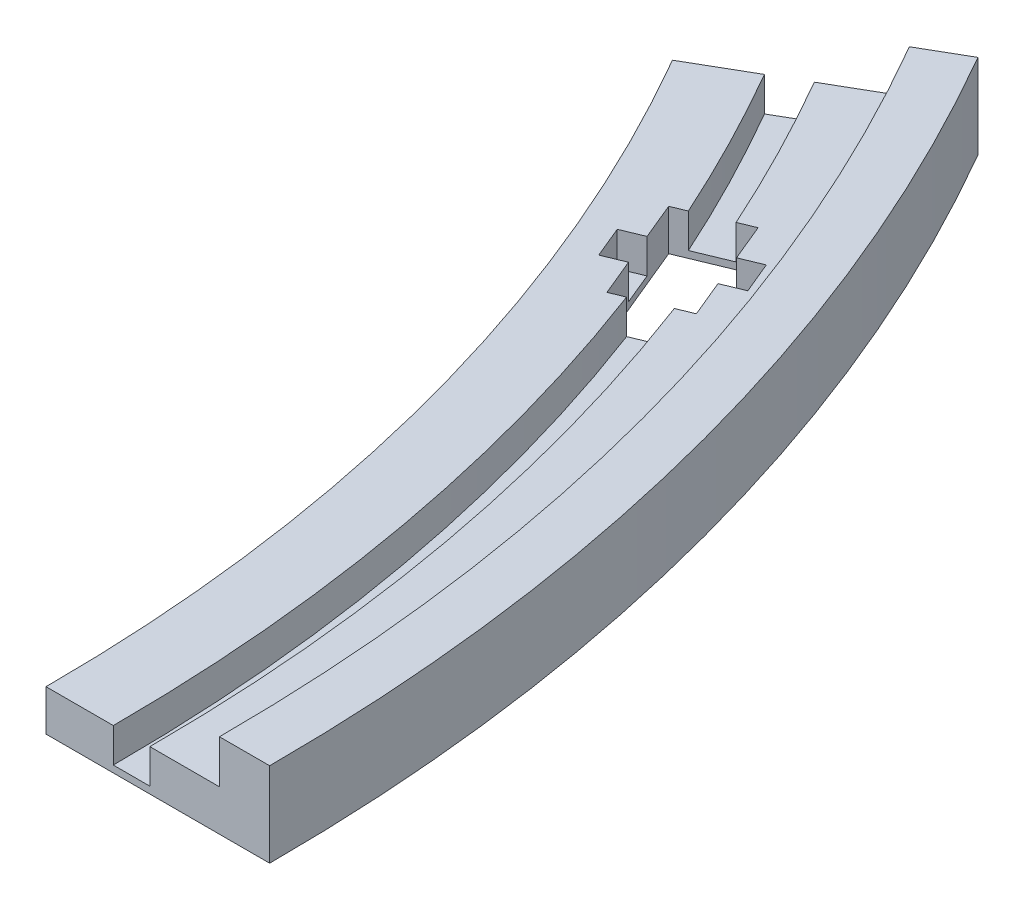
ISO-10303-21;
HEADER;
FILE_DESCRIPTION(('STEP AP214'),'2;1');
FILE_NAME('part.step','',(''),(''),'','','');
FILE_SCHEMA(('AUTOMOTIVE_DESIGN { 1 0 10303 214 1 1 1 1 }'));
ENDSEC;
DATA;
#1=APPLICATION_CONTEXT('core data for automotive mechanical design processes');
#2=APPLICATION_PROTOCOL_DEFINITION('international standard','automotive_design',2000,#1);
#3=PRODUCT_CONTEXT('',#1,'mechanical');
#4=PRODUCT('Part','Part','',(#3));
#5=PRODUCT_RELATED_PRODUCT_CATEGORY('part','',(#4));
#6=PRODUCT_DEFINITION_FORMATION('','',#4);
#7=PRODUCT_DEFINITION_CONTEXT('part definition',#1,'design');
#8=PRODUCT_DEFINITION('design','',#6,#7);
#9=PRODUCT_DEFINITION_SHAPE('','',#8);
#10=(LENGTH_UNIT() NAMED_UNIT(*) SI_UNIT(.MILLI.,.METRE.));
#11=(NAMED_UNIT(*) PLANE_ANGLE_UNIT() SI_UNIT($,.RADIAN.));
#12=(NAMED_UNIT(*) SI_UNIT($,.STERADIAN.) SOLID_ANGLE_UNIT());
#13=UNCERTAINTY_MEASURE_WITH_UNIT(LENGTH_MEASURE(1.E-05),#10,'distance_accuracy_value','');
#14=(GEOMETRIC_REPRESENTATION_CONTEXT(3) GLOBAL_UNCERTAINTY_ASSIGNED_CONTEXT((#13)) GLOBAL_UNIT_ASSIGNED_CONTEXT((#10,
#11,#12)) REPRESENTATION_CONTEXT('',''));
#15=CARTESIAN_POINT('',(0.,0.,0.));
#16=DIRECTION('',(0.,0.,1.));
#17=DIRECTION('',(1.,0.,0.));
#18=AXIS2_PLACEMENT_3D('',#15,#16,#17);
#19=CARTESIAN_POINT('',(0.,3.6,0.));
#20=DIRECTION('',(0.,1.,0.));
#21=DIRECTION('',(0.,0.,1.));
#22=AXIS2_PLACEMENT_3D('',#19,#20,#21);
#23=PLANE('',#22);
#24=DIRECTION('',(1.,0.,0.));
#25=VECTOR('',#24,1.);
#26=CARTESIAN_POINT('',(150.,3.6,0.));
#27=LINE('',#26,#25);
#28=CARTESIAN_POINT('',(159.1,3.6,0.));
#29=VERTEX_POINT('',#28);
#30=CARTESIAN_POINT('',(165.2,3.6,0.));
#31=VERTEX_POINT('',#30);
#32=EDGE_CURVE('E57',#29,#31,#27,.T.);
#33=ORIENTED_EDGE('',*,*,#32,.T.);
#34=CARTESIAN_POINT('',(0.,3.6,0.));
#35=DIRECTION('',(0.,-1.,0.));
#36=DIRECTION('',(0.,0.,1.));
#37=AXIS2_PLACEMENT_3D('',#34,#35,#36);
#38=CIRCLE('',#37,165.2);
#39=CARTESIAN_POINT('',(143.067396705189,3.6,-82.6000000000002));
#40=VERTEX_POINT('',#39);
#41=EDGE_CURVE('E52',#40,#31,#38,.T.);
#42=ORIENTED_EDGE('',*,*,#41,.F.);
#43=DIRECTION('',(-0.866025403784437,0.,0.500000000000003));
#44=VECTOR('',#43,1.);
#45=CARTESIAN_POINT('',(146.877908481841,3.6,-84.8000000000002));
#46=LINE('',#45,#44);
#47=CARTESIAN_POINT('',(137.784641742104,3.6,-79.5500000000003));
#48=VERTEX_POINT('',#47);
#49=EDGE_CURVE('E379',#40,#48,#46,.T.);
#50=ORIENTED_EDGE('',*,*,#49,.T.);
#51=CARTESIAN_POINT('',(0.,3.6,0.));
#52=DIRECTION('',(0.,1.,0.));
#53=DIRECTION('',(0.,0.,1.));
#54=AXIS2_PLACEMENT_3D('',#51,#52,#53);
#55=CIRCLE('',#54,159.1);
#56=CARTESIAN_POINT('',(145.003212142615,3.6,-65.4742580585964));
#57=VERTEX_POINT('',#56);
#58=EDGE_CURVE('E357',#57,#48,#55,.T.);
#59=ORIENTED_EDGE('',*,*,#58,.F.);
#60=DIRECTION('',(-0.923879532511286,0.,0.382683432365092));
#61=VECTOR('',#60,1.);
#62=CARTESIAN_POINT('',(140.825970611168,3.6,-63.7439879629629));
#63=LINE('',#62,#61);
#64=CARTESIAN_POINT('',(146.369247806236,3.6,-66.0400885571534));
#65=VERTEX_POINT('',#64);
#66=EDGE_CURVE('E293',#65,#57,#63,.T.);
#67=ORIENTED_EDGE('',*,*,#66,.F.);
#68=DIRECTION('',(-0.382683432365091,0.,-0.923879532511286));
#69=VECTOR('',#68,1.);
#70=CARTESIAN_POINT('',(146.369247806236,3.6,-66.0400885571534));
#71=LINE('',#70,#69);
#72=CARTESIAN_POINT('',(147.708639819514,3.6,-62.8065101933639));
#73=VERTEX_POINT('',#72);
#74=EDGE_CURVE('E309',#73,#65,#71,.T.);
#75=ORIENTED_EDGE('',*,*,#74,.F.);
#76=DIRECTION('',(-0.923879532511287,0.,0.38268343236509));
#77=VECTOR('',#76,1.);
#78=CARTESIAN_POINT('',(140.317603559424,3.6,-59.7450427344432));
#79=LINE('',#78,#77);
#80=CARTESIAN_POINT('',(149.556398884536,3.6,-63.5718770580941));
#81=VERTEX_POINT('',#80);
#82=EDGE_CURVE('E250',#81,#73,#79,.T.);
#83=ORIENTED_EDGE('',*,*,#82,.F.);
#84=DIRECTION('',(-0.382683432365092,0.,-0.923879532511286));
#85=VECTOR('',#84,1.);
#86=CARTESIAN_POINT('',(149.556398884536,3.6,-63.5718770580941));
#87=LINE('',#86,#85);
#88=CARTESIAN_POINT('',(150.704449181632,3.6,-60.8002384605603));
#89=VERTEX_POINT('',#88);
#90=EDGE_CURVE('E265',#89,#81,#87,.T.);
#91=ORIENTED_EDGE('',*,*,#90,.F.);
#92=DIRECTION('',(0.923879532511286,0.,-0.382683432365091));
#93=VECTOR('',#92,1.);
#94=CARTESIAN_POINT('',(150.704449181632,3.6,-60.8002384605603));
#95=LINE('',#94,#93);
#96=CARTESIAN_POINT('',(148.856690116609,3.6,-60.0348715958301));
#97=VERTEX_POINT('',#96);
#98=EDGE_CURVE('E262',#97,#89,#95,.T.);
#99=ORIENTED_EDGE('',*,*,#98,.F.);
#100=CARTESIAN_POINT('',(150.196082129887,3.6,-56.8012932320406));
#101=VERTEX_POINT('',#100);
#102=EDGE_CURVE('E310',#101,#97,#71,.T.);
#103=ORIENTED_EDGE('',*,*,#102,.F.);
#104=DIRECTION('',(0.923879532511286,0.,-0.382683432365092));
#105=VECTOR('',#104,1.);
#106=CARTESIAN_POINT('',(150.196082129887,3.6,-56.8012932320406));
#107=LINE('',#106,#105);
#108=CARTESIAN_POINT('',(148.830046466266,3.6,-56.2354627334836));
#109=VERTEX_POINT('',#108);
#110=EDGE_CURVE('E306',#109,#101,#107,.T.);
#111=ORIENTED_EDGE('',*,*,#110,.F.);
#112=EDGE_CURVE('E358',#29,#109,#55,.T.);
#113=ORIENTED_EDGE('',*,*,#112,.F.);
#114=EDGE_LOOP('',(#33,#42,#50,#59,#67,#75,#83,#91,#99,#103,#111,#113));
#115=FACE_BOUND('',#114,.T.);
#116=ADVANCED_FACE('F37',(#115),#23,.T.);
#117=CARTESIAN_POINT('',(0.,0.599999999999999,0.));
#118=DIRECTION('',(0.,1.,0.));
#119=DIRECTION('',(0.,0.,1.));
#120=AXIS2_PLACEMENT_3D('',#117,#118,#119);
#121=CYLINDRICAL_SURFACE('',#120,155.9);
#122=CARTESIAN_POINT('',(0.,3.6,0.));
#123=DIRECTION('',(0.,-1.,0.));
#124=DIRECTION('',(0.,0.,1.));
#125=AXIS2_PLACEMENT_3D('',#122,#123,#124);
#126=CIRCLE('',#125,155.9);
#127=CARTESIAN_POINT('',(135.013360449994,3.6,-77.9500000000002));
#128=VERTEX_POINT('',#127);
#129=CARTESIAN_POINT('',(142.045306604609,3.6,-64.2490534685355));
#130=VERTEX_POINT('',#129);
#131=EDGE_CURVE('E354',#128,#130,#126,.T.);
#132=ORIENTED_EDGE('',*,*,#131,.T.);
#133=DIRECTION('',(0.,1.,0.));
#134=VECTOR('',#133,1.);
#135=CARTESIAN_POINT('',(142.045306604609,0.599999999999999,-64.2490534685355));
#136=LINE('',#135,#134);
#137=CARTESIAN_POINT('',(142.045306604609,0.599999999999999,-64.2490534685355));
#138=VERTEX_POINT('',#137);
#139=EDGE_CURVE('E335',#130,#138,#136,.F.);
#140=ORIENTED_EDGE('',*,*,#139,.T.);
#141=CARTESIAN_POINT('',(0.,0.599999999999999,0.));
#142=DIRECTION('',(0.,-1.,0.));
#143=DIRECTION('',(0.,0.,1.));
#144=AXIS2_PLACEMENT_3D('',#141,#142,#143);
#145=CIRCLE('',#144,155.9);
#146=CARTESIAN_POINT('',(135.013360449994,0.599999999999999,-77.9500000000002));
#147=VERTEX_POINT('',#146);
#148=EDGE_CURVE('E339',#147,#138,#145,.T.);
#149=ORIENTED_EDGE('',*,*,#148,.F.);
#150=DIRECTION('',(0.,1.,0.));
#151=VECTOR('',#150,1.);
#152=CARTESIAN_POINT('',(135.013360449994,0.599999999999999,-77.9500000000002));
#153=LINE('',#152,#151);
#154=EDGE_CURVE('E361',#147,#128,#153,.T.);
#155=ORIENTED_EDGE('',*,*,#154,.T.);
#156=EDGE_LOOP('',(#132,#140,#149,#155));
#157=FACE_BOUND('',#156,.T.);
#158=ADVANCED_FACE('F438',(#157),#121,.T.);
#159=CARTESIAN_POINT('',(0.,0.599999999999999,0.));
#160=DIRECTION('',(0.,1.,0.));
#161=DIRECTION('',(0.,0.,1.));
#162=AXIS2_PLACEMENT_3D('',#159,#160,#161);
#163=CYLINDRICAL_SURFACE('',#162,159.1);
#164=CARTESIAN_POINT('',(0.,0.599999999999999,0.));
#165=DIRECTION('',(0.,1.,0.));
#166=DIRECTION('',(0.,0.,1.));
#167=AXIS2_PLACEMENT_3D('',#164,#165,#166);
#168=CIRCLE('',#167,159.1);
#169=CARTESIAN_POINT('',(145.003212142615,0.599999999999999,-65.4742580585964));
#170=VERTEX_POINT('',#169);
#171=CARTESIAN_POINT('',(137.784641742104,0.599999999999999,-79.5500000000003));
#172=VERTEX_POINT('',#171);
#173=EDGE_CURVE('E346',#170,#172,#168,.T.);
#174=ORIENTED_EDGE('',*,*,#173,.F.);
#175=DIRECTION('',(0.,1.,0.));
#176=VECTOR('',#175,1.);
#177=CARTESIAN_POINT('',(145.003212142615,0.599999999999999,-65.4742580585964));
#178=LINE('',#177,#176);
#179=EDGE_CURVE('E332',#170,#57,#178,.T.);
#180=ORIENTED_EDGE('',*,*,#179,.T.);
#181=ORIENTED_EDGE('',*,*,#58,.T.);
#182=DIRECTION('',(0.,1.,0.));
#183=VECTOR('',#182,1.);
#184=CARTESIAN_POINT('',(137.784641742104,0.599999999999999,-79.5500000000003));
#185=LINE('',#184,#183);
#186=EDGE_CURVE('E364',#172,#48,#185,.T.);
#187=ORIENTED_EDGE('',*,*,#186,.F.);
#188=EDGE_LOOP('',(#174,#180,#181,#187));
#189=FACE_BOUND('',#188,.T.);
#190=ADVANCED_FACE('F430',(#189),#163,.F.);
#191=CARTESIAN_POINT('',(0.,0.599999999999999,0.));
#192=DIRECTION('',(0.,1.,0.));
#193=DIRECTION('',(0.,0.,1.));
#194=AXIS2_PLACEMENT_3D('',#191,#192,#193);
#195=PLANE('',#194);
#196=DIRECTION('',(-0.923879532511286,0.,0.382683432365092));
#197=VECTOR('',#196,1.);
#198=CARTESIAN_POINT('',(-1.91341716182537,0.599999999999999,-4.61939766255622));
#199=LINE('',#198,#197);
#200=EDGE_CURVE('E395',#170,#138,#199,.T.);
#201=ORIENTED_EDGE('',*,*,#200,.F.);
#202=ORIENTED_EDGE('',*,*,#173,.T.);
#203=DIRECTION('',(-0.866025403784431,0.,0.500000000000013));
#204=VECTOR('',#203,1.);
#205=CARTESIAN_POINT('',(135.013360449994,0.599999999999999,-77.9500000000002));
#206=LINE('',#205,#204);
#207=EDGE_CURVE('E350',#172,#147,#206,.T.);
#208=ORIENTED_EDGE('',*,*,#207,.T.);
#209=ORIENTED_EDGE('',*,*,#148,.T.);
#210=EDGE_LOOP('',(#201,#202,#208,#209));
#211=FACE_BOUND('',#210,.T.);
#212=ADVANCED_FACE('F434',(#211),#195,.T.);
#213=CARTESIAN_POINT('',(142.165362624446,3.6,-60.5104095991734));
#214=VERTEX_POINT('',#213);
#215=CARTESIAN_POINT('',(140.317603559424,3.6,-59.7450427344432));
#216=VERTEX_POINT('',#215);
#217=EDGE_CURVE('E268',#214,#216,#79,.T.);
#218=ORIENTED_EDGE('',*,*,#217,.F.);
#219=DIRECTION('',(0.382683432365091,0.,0.923879532511286));
#220=VECTOR('',#219,1.);
#221=CARTESIAN_POINT('',(144.652804934819,3.6,-54.50519263785));
#222=LINE('',#221,#220);
#223=CARTESIAN_POINT('',(140.825970611168,3.6,-63.7439879629629));
#224=VERTEX_POINT('',#223);
#225=EDGE_CURVE('E303',#224,#214,#222,.T.);
#226=ORIENTED_EDGE('',*,*,#225,.F.);
#227=EDGE_CURVE('E313',#130,#224,#63,.T.);
#228=ORIENTED_EDGE('',*,*,#227,.F.);
#229=ORIENTED_EDGE('',*,*,#131,.F.);
#230=CARTESIAN_POINT('',(129.903810567666,3.6,-75.0000000000002));
#231=VERTEX_POINT('',#230);
#232=EDGE_CURVE('E378',#128,#231,#46,.T.);
#233=ORIENTED_EDGE('',*,*,#232,.T.);
#234=CARTESIAN_POINT('',(0.,3.6,0.));
#235=DIRECTION('',(0.,-1.,0.));
#236=DIRECTION('',(0.,0.,1.));
#237=AXIS2_PLACEMENT_3D('',#234,#235,#236);
#238=CIRCLE('',#237,150.);
#239=CARTESIAN_POINT('',(150.,3.6,0.));
#240=VERTEX_POINT('',#239);
#241=EDGE_CURVE('E371',#231,#240,#238,.T.);
#242=ORIENTED_EDGE('',*,*,#241,.T.);
#243=CARTESIAN_POINT('',(155.9,3.6,0.));
#244=VERTEX_POINT('',#243);
#245=EDGE_CURVE('E375',#240,#244,#27,.T.);
#246=ORIENTED_EDGE('',*,*,#245,.T.);
#247=CARTESIAN_POINT('',(145.872140928259,3.6,-55.0102581434227));
#248=VERTEX_POINT('',#247);
#249=EDGE_CURVE('E338',#248,#244,#126,.T.);
#250=ORIENTED_EDGE('',*,*,#249,.F.);
#251=CARTESIAN_POINT('',(144.652804934819,3.6,-54.50519263785));
#252=VERTEX_POINT('',#251);
#253=EDGE_CURVE('E307',#252,#248,#107,.T.);
#254=ORIENTED_EDGE('',*,*,#253,.F.);
#255=CARTESIAN_POINT('',(143.313412921541,3.6,-57.7387710016395));
#256=VERTEX_POINT('',#255);
#257=EDGE_CURVE('E288',#256,#252,#222,.T.);
#258=ORIENTED_EDGE('',*,*,#257,.F.);
#259=CARTESIAN_POINT('',(141.465653856519,3.6,-56.9734041369093));
#260=VERTEX_POINT('',#259);
#261=EDGE_CURVE('E263',#260,#256,#95,.T.);
#262=ORIENTED_EDGE('',*,*,#261,.F.);
#263=DIRECTION('',(0.382683432365091,0.,0.923879532511286));
#264=VECTOR('',#263,1.);
#265=CARTESIAN_POINT('',(141.465653856519,3.6,-56.9734041369093));
#266=LINE('',#265,#264);
#267=EDGE_CURVE('E245',#216,#260,#266,.T.);
#268=ORIENTED_EDGE('',*,*,#267,.F.);
#269=EDGE_LOOP('',(#218,#226,#228,#229,#233,#242,#246,#250,#254,#258,#262,#268));
#270=FACE_BOUND('',#269,.T.);
#271=ADVANCED_FACE('F442',(#270),#23,.T.);
#272=CARTESIAN_POINT('',(0.,3.6,0.));
#273=DIRECTION('',(0.,-1.,0.));
#274=DIRECTION('',(0.,0.,-1.));
#275=AXIS2_PLACEMENT_3D('',#272,#273,#274);
#276=CYLINDRICAL_SURFACE('',#275,150.);
#277=CARTESIAN_POINT('',(0.,0.,0.));
#278=DIRECTION('',(0.,-1.,0.));
#279=DIRECTION('',(0.,0.,1.));
#280=AXIS2_PLACEMENT_3D('',#277,#278,#279);
#281=CIRCLE('',#280,150.);
#282=CARTESIAN_POINT('',(129.903810567666,0.,-75.0000000000002));
#283=VERTEX_POINT('',#282);
#284=CARTESIAN_POINT('',(150.,0.,0.));
#285=VERTEX_POINT('',#284);
#286=EDGE_CURVE('E363',#283,#285,#281,.T.);
#287=ORIENTED_EDGE('',*,*,#286,.T.);
#288=DIRECTION('',(0.,-1.,0.));
#289=VECTOR('',#288,1.);
#290=CARTESIAN_POINT('',(150.,3.6,0.));
#291=LINE('',#290,#289);
#292=EDGE_CURVE('E390',#240,#285,#291,.T.);
#293=ORIENTED_EDGE('',*,*,#292,.F.);
#294=ORIENTED_EDGE('',*,*,#241,.F.);
#295=DIRECTION('',(0.,-1.,0.));
#296=VECTOR('',#295,1.);
#297=CARTESIAN_POINT('',(129.903810567666,3.6,-75.0000000000002));
#298=LINE('',#297,#296);
#299=EDGE_CURVE('E220',#231,#283,#298,.T.);
#300=ORIENTED_EDGE('',*,*,#299,.T.);
#301=EDGE_LOOP('',(#287,#293,#294,#300));
#302=FACE_BOUND('',#301,.T.);
#303=ADVANCED_FACE('F39',(#302),#276,.F.);
#304=CARTESIAN_POINT('',(150.,3.6,0.));
#305=DIRECTION('',(0.,0.,-1.));
#306=DIRECTION('',(-1.,0.,0.));
#307=AXIS2_PLACEMENT_3D('',#304,#305,#306);
#308=PLANE('',#307);
#309=DIRECTION('',(1.,0.,0.));
#310=VECTOR('',#309,1.);
#311=CARTESIAN_POINT('',(155.9,0.599999999999999,0.));
#312=LINE('',#311,#310);
#313=CARTESIAN_POINT('',(155.9,0.599999999999999,0.));
#314=VERTEX_POINT('',#313);
#315=CARTESIAN_POINT('',(159.1,0.599999999999999,0.));
#316=VERTEX_POINT('',#315);
#317=EDGE_CURVE('E342',#314,#316,#312,.T.);
#318=ORIENTED_EDGE('',*,*,#317,.F.);
#319=DIRECTION('',(0.,1.,0.));
#320=VECTOR('',#319,1.);
#321=CARTESIAN_POINT('',(155.9,0.599999999999999,0.));
#322=LINE('',#321,#320);
#323=EDGE_CURVE('E353',#314,#244,#322,.T.);
#324=ORIENTED_EDGE('',*,*,#323,.T.);
#325=ORIENTED_EDGE('',*,*,#245,.F.);
#326=ORIENTED_EDGE('',*,*,#292,.T.);
#327=DIRECTION('',(1.,0.,0.));
#328=VECTOR('',#327,1.);
#329=CARTESIAN_POINT('',(150.,0.,0.));
#330=LINE('',#329,#328);
#331=CARTESIAN_POINT('',(169.6,0.,0.));
#332=VERTEX_POINT('',#331);
#333=EDGE_CURVE('E383',#285,#332,#330,.T.);
#334=ORIENTED_EDGE('',*,*,#333,.T.);
#335=DIRECTION('',(0.,-1.,0.));
#336=VECTOR('',#335,1.);
#337=CARTESIAN_POINT('',(169.6,3.6,0.));
#338=LINE('',#337,#336);
#339=CARTESIAN_POINT('',(169.6,7.4,0.));
#340=VERTEX_POINT('',#339);
#341=EDGE_CURVE('E219',#340,#332,#338,.T.);
#342=ORIENTED_EDGE('',*,*,#341,.F.);
#343=DIRECTION('',(1.,0.,0.));
#344=VECTOR('',#343,1.);
#345=CARTESIAN_POINT('',(165.2,7.4,0.));
#346=LINE('',#345,#344);
#347=CARTESIAN_POINT('',(165.2,7.4,0.));
#348=VERTEX_POINT('',#347);
#349=EDGE_CURVE('E235',#348,#340,#346,.T.);
#350=ORIENTED_EDGE('',*,*,#349,.F.);
#351=DIRECTION('',(0.,-1.,0.));
#352=VECTOR('',#351,1.);
#353=CARTESIAN_POINT('',(165.2,7.4,0.));
#354=LINE('',#353,#352);
#355=EDGE_CURVE('E240',#348,#31,#354,.T.);
#356=ORIENTED_EDGE('',*,*,#355,.T.);
#357=ORIENTED_EDGE('',*,*,#32,.F.);
#358=DIRECTION('',(0.,1.,0.));
#359=VECTOR('',#358,1.);
#360=CARTESIAN_POINT('',(159.1,0.599999999999999,0.));
#361=LINE('',#360,#359);
#362=EDGE_CURVE('E367',#316,#29,#361,.T.);
#363=ORIENTED_EDGE('',*,*,#362,.F.);
#364=EDGE_LOOP('',(#318,#324,#325,#326,#334,#342,#350,#356,#357,#363));
#365=FACE_BOUND('',#364,.T.);
#366=ADVANCED_FACE('F453',(#365),#308,.F.);
#367=CARTESIAN_POINT('',(0.,3.6,0.));
#368=DIRECTION('',(0.,-1.,0.));
#369=DIRECTION('',(0.,0.,-1.));
#370=AXIS2_PLACEMENT_3D('',#367,#368,#369);
#371=CYLINDRICAL_SURFACE('',#370,169.6);
#372=CARTESIAN_POINT('',(0.,0.,0.));
#373=DIRECTION('',(0.,1.,0.));
#374=DIRECTION('',(0.,0.,1.));
#375=AXIS2_PLACEMENT_3D('',#372,#373,#374);
#376=CIRCLE('',#375,169.6);
#377=CARTESIAN_POINT('',(146.877908481841,0.,-84.8000000000002));
#378=VERTEX_POINT('',#377);
#379=EDGE_CURVE('E216',#332,#378,#376,.T.);
#380=ORIENTED_EDGE('',*,*,#379,.T.);
#381=DIRECTION('',(0.,-1.,0.));
#382=VECTOR('',#381,1.);
#383=CARTESIAN_POINT('',(146.877908481841,3.6,-84.8000000000002));
#384=LINE('',#383,#382);
#385=CARTESIAN_POINT('',(146.877908481841,7.4,-84.8000000000002));
#386=VERTEX_POINT('',#385);
#387=EDGE_CURVE('E209',#386,#378,#384,.T.);
#388=ORIENTED_EDGE('',*,*,#387,.F.);
#389=CARTESIAN_POINT('',(0.,7.4,0.));
#390=DIRECTION('',(0.,1.,0.));
#391=DIRECTION('',(0.,0.,1.));
#392=AXIS2_PLACEMENT_3D('',#389,#390,#391);
#393=CIRCLE('',#392,169.6);
#394=EDGE_CURVE('E214',#340,#386,#393,.T.);
#395=ORIENTED_EDGE('',*,*,#394,.F.);
#396=ORIENTED_EDGE('',*,*,#341,.T.);
#397=EDGE_LOOP('',(#380,#388,#395,#396));
#398=FACE_BOUND('',#397,.T.);
#399=ADVANCED_FACE('F211',(#398),#371,.T.);
#400=CARTESIAN_POINT('',(146.877908481841,3.6,-84.8000000000002));
#401=DIRECTION('',(0.500000000000003,0.,0.866025403784437));
#402=DIRECTION('',(0.866025403784437,0.,-0.500000000000003));
#403=AXIS2_PLACEMENT_3D('',#400,#401,#402);
#404=PLANE('',#403);
#405=ORIENTED_EDGE('',*,*,#232,.F.);
#406=ORIENTED_EDGE('',*,*,#154,.F.);
#407=ORIENTED_EDGE('',*,*,#207,.F.);
#408=ORIENTED_EDGE('',*,*,#186,.T.);
#409=ORIENTED_EDGE('',*,*,#49,.F.);
#410=DIRECTION('',(0.,-1.,0.));
#411=VECTOR('',#410,1.);
#412=CARTESIAN_POINT('',(143.067396705189,7.4,-82.6000000000002));
#413=LINE('',#412,#411);
#414=CARTESIAN_POINT('',(143.067396705189,7.4,-82.6000000000002));
#415=VERTEX_POINT('',#414);
#416=EDGE_CURVE('E227',#415,#40,#413,.T.);
#417=ORIENTED_EDGE('',*,*,#416,.F.);
#418=DIRECTION('',(-0.866025403784441,0.,0.499999999999996));
#419=VECTOR('',#418,1.);
#420=CARTESIAN_POINT('',(143.067396705189,7.4,-82.6000000000002));
#421=LINE('',#420,#419);
#422=EDGE_CURVE('E223',#386,#415,#421,.T.);
#423=ORIENTED_EDGE('',*,*,#422,.F.);
#424=ORIENTED_EDGE('',*,*,#387,.T.);
#425=DIRECTION('',(-0.866025403784437,0.,0.500000000000003));
#426=VECTOR('',#425,1.);
#427=CARTESIAN_POINT('',(146.877908481841,0.,-84.8000000000002));
#428=LINE('',#427,#426);
#429=EDGE_CURVE('E374',#378,#283,#428,.T.);
#430=ORIENTED_EDGE('',*,*,#429,.T.);
#431=ORIENTED_EDGE('',*,*,#299,.F.);
#432=EDGE_LOOP('',(#405,#406,#407,#408,#409,#417,#423,#424,#430,#431));
#433=FACE_BOUND('',#432,.T.);
#434=ADVANCED_FACE('F225',(#433),#404,.F.);
#435=CARTESIAN_POINT('',(0.,0.,0.));
#436=DIRECTION('',(0.,1.,0.));
#437=DIRECTION('',(0.,0.,1.));
#438=AXIS2_PLACEMENT_3D('',#435,#436,#437);
#439=PLANE('',#438);
#440=DIRECTION('',(-0.923879532511286,0.,0.382683432365092));
#441=VECTOR('',#440,1.);
#442=CARTESIAN_POINT('',(140.825970611168,0.,-63.7439879629629));
#443=LINE('',#442,#441);
#444=CARTESIAN_POINT('',(146.369247806236,0.,-66.0400885571534));
#445=VERTEX_POINT('',#444);
#446=CARTESIAN_POINT('',(140.825970611168,0.,-63.7439879629629));
#447=VERTEX_POINT('',#446);
#448=EDGE_CURVE('E299',#445,#447,#443,.T.);
#449=ORIENTED_EDGE('',*,*,#448,.T.);
#450=DIRECTION('',(0.382683432365091,0.,0.923879532511286));
#451=VECTOR('',#450,1.);
#452=CARTESIAN_POINT('',(144.652804934819,0.,-54.50519263785));
#453=LINE('',#452,#451);
#454=CARTESIAN_POINT('',(144.652804934819,0.,-54.50519263785));
#455=VERTEX_POINT('',#454);
#456=EDGE_CURVE('E289',#447,#455,#453,.T.);
#457=ORIENTED_EDGE('',*,*,#456,.T.);
#458=DIRECTION('',(0.923879532511286,0.,-0.382683432365092));
#459=VECTOR('',#458,1.);
#460=CARTESIAN_POINT('',(150.196082129887,0.,-56.8012932320406));
#461=LINE('',#460,#459);
#462=CARTESIAN_POINT('',(150.196082129887,0.,-56.8012932320406));
#463=VERTEX_POINT('',#462);
#464=EDGE_CURVE('E292',#455,#463,#461,.T.);
#465=ORIENTED_EDGE('',*,*,#464,.T.);
#466=DIRECTION('',(-0.382683432365091,0.,-0.923879532511286));
#467=VECTOR('',#466,1.);
#468=CARTESIAN_POINT('',(146.369247806236,0.,-66.0400885571534));
#469=LINE('',#468,#467);
#470=EDGE_CURVE('E296',#463,#445,#469,.T.);
#471=ORIENTED_EDGE('',*,*,#470,.T.);
#472=EDGE_LOOP('',(#449,#457,#465,#471));
#473=FACE_BOUND('',#472,.T.);
#474=ORIENTED_EDGE('',*,*,#286,.F.);
#475=ORIENTED_EDGE('',*,*,#429,.F.);
#476=ORIENTED_EDGE('',*,*,#379,.F.);
#477=ORIENTED_EDGE('',*,*,#333,.F.);
#478=EDGE_LOOP('',(#474,#475,#476,#477));
#479=FACE_BOUND('',#478,.T.);
#480=ADVANCED_FACE('F509',(#473,#479),#439,.F.);
#481=CARTESIAN_POINT('',(145.87214092826,0.599999999999999,-55.0102581434227));
#482=VERTEX_POINT('',#481);
#483=EDGE_CURVE('E343',#482,#314,#145,.T.);
#484=ORIENTED_EDGE('',*,*,#483,.F.);
#485=DIRECTION('',(0.,1.,0.));
#486=VECTOR('',#485,1.);
#487=CARTESIAN_POINT('',(145.87214092826,0.599999999999999,-55.0102581434227));
#488=LINE('',#487,#486);
#489=EDGE_CURVE('E329',#482,#248,#488,.T.);
#490=ORIENTED_EDGE('',*,*,#489,.T.);
#491=ORIENTED_EDGE('',*,*,#249,.T.);
#492=ORIENTED_EDGE('',*,*,#323,.F.);
#493=EDGE_LOOP('',(#484,#490,#491,#492));
#494=FACE_BOUND('',#493,.T.);
#495=ADVANCED_FACE('F458',(#494),#121,.T.);
#496=ORIENTED_EDGE('',*,*,#112,.T.);
#497=DIRECTION('',(0.,1.,0.));
#498=VECTOR('',#497,1.);
#499=CARTESIAN_POINT('',(148.830046466266,0.599999999999999,-56.2354627334836));
#500=LINE('',#499,#498);
#501=CARTESIAN_POINT('',(148.830046466266,0.599999999999999,-56.2354627334836));
#502=VERTEX_POINT('',#501);
#503=EDGE_CURVE('E318',#109,#502,#500,.F.);
#504=ORIENTED_EDGE('',*,*,#503,.T.);
#505=EDGE_CURVE('E347',#316,#502,#168,.T.);
#506=ORIENTED_EDGE('',*,*,#505,.F.);
#507=ORIENTED_EDGE('',*,*,#362,.T.);
#508=EDGE_LOOP('',(#496,#504,#506,#507));
#509=FACE_BOUND('',#508,.T.);
#510=ADVANCED_FACE('F465',(#509),#163,.F.);
#511=DIRECTION('',(0.923879532511286,0.,-0.382683432365092));
#512=VECTOR('',#511,1.);
#513=CARTESIAN_POINT('',(1.91341716182554,0.599999999999999,4.61939766255663));
#514=LINE('',#513,#512);
#515=EDGE_CURVE('E393',#482,#502,#514,.T.);
#516=ORIENTED_EDGE('',*,*,#515,.F.);
#517=ORIENTED_EDGE('',*,*,#483,.T.);
#518=ORIENTED_EDGE('',*,*,#317,.T.);
#519=ORIENTED_EDGE('',*,*,#505,.T.);
#520=EDGE_LOOP('',(#516,#517,#518,#519));
#521=FACE_BOUND('',#520,.T.);
#522=ADVANCED_FACE('F463',(#521),#195,.T.);
#523=CARTESIAN_POINT('',(140.825970611168,0.,-63.7439879629629));
#524=DIRECTION('',(-0.382683432365092,0.,-0.923879532511286));
#525=DIRECTION('',(-0.923879532511286,0.,0.382683432365092));
#526=AXIS2_PLACEMENT_3D('',#523,#524,#525);
#527=PLANE('',#526);
#528=ORIENTED_EDGE('',*,*,#227,.T.);
#529=DIRECTION('',(0.,1.,0.));
#530=VECTOR('',#529,1.);
#531=CARTESIAN_POINT('',(140.825970611168,0.,-63.7439879629629));
#532=LINE('',#531,#530);
#533=EDGE_CURVE('E315',#447,#224,#532,.T.);
#534=ORIENTED_EDGE('',*,*,#533,.F.);
#535=ORIENTED_EDGE('',*,*,#448,.F.);
#536=DIRECTION('',(0.,1.,0.));
#537=VECTOR('',#536,1.);
#538=CARTESIAN_POINT('',(146.369247806236,0.,-66.0400885571534));
#539=LINE('',#538,#537);
#540=EDGE_CURVE('E319',#445,#65,#539,.T.);
#541=ORIENTED_EDGE('',*,*,#540,.T.);
#542=ORIENTED_EDGE('',*,*,#66,.T.);
#543=ORIENTED_EDGE('',*,*,#179,.F.);
#544=ORIENTED_EDGE('',*,*,#200,.T.);
#545=ORIENTED_EDGE('',*,*,#139,.F.);
#546=EDGE_LOOP('',(#528,#534,#535,#541,#542,#543,#544,#545));
#547=FACE_BOUND('',#546,.T.);
#548=ADVANCED_FACE('F425',(#547),#527,.F.);
#549=CARTESIAN_POINT('',(150.196082129887,0.,-56.8012932320406));
#550=DIRECTION('',(0.382683432365092,0.,0.923879532511286));
#551=DIRECTION('',(0.923879532511286,0.,-0.382683432365092));
#552=AXIS2_PLACEMENT_3D('',#549,#550,#551);
#553=PLANE('',#552);
#554=ORIENTED_EDGE('',*,*,#515,.T.);
#555=ORIENTED_EDGE('',*,*,#503,.F.);
#556=ORIENTED_EDGE('',*,*,#110,.T.);
#557=DIRECTION('',(0.,1.,0.));
#558=VECTOR('',#557,1.);
#559=CARTESIAN_POINT('',(150.196082129887,0.,-56.8012932320406));
#560=LINE('',#559,#558);
#561=EDGE_CURVE('E322',#463,#101,#560,.T.);
#562=ORIENTED_EDGE('',*,*,#561,.F.);
#563=ORIENTED_EDGE('',*,*,#464,.F.);
#564=DIRECTION('',(0.,1.,0.));
#565=VECTOR('',#564,1.);
#566=CARTESIAN_POINT('',(144.652804934819,0.,-54.50519263785));
#567=LINE('',#566,#565);
#568=EDGE_CURVE('E302',#455,#252,#567,.T.);
#569=ORIENTED_EDGE('',*,*,#568,.T.);
#570=ORIENTED_EDGE('',*,*,#253,.T.);
#571=ORIENTED_EDGE('',*,*,#489,.F.);
#572=EDGE_LOOP('',(#554,#555,#556,#562,#563,#569,#570,#571));
#573=FACE_BOUND('',#572,.T.);
#574=ADVANCED_FACE('F461',(#573),#553,.F.);
#575=CARTESIAN_POINT('',(144.652804934819,0.,-54.50519263785));
#576=DIRECTION('',(-0.923879532511286,0.,0.382683432365091));
#577=DIRECTION('',(0.382683432365091,0.,0.923879532511286));
#578=AXIS2_PLACEMENT_3D('',#575,#576,#577);
#579=PLANE('',#578);
#580=ORIENTED_EDGE('',*,*,#225,.T.);
#581=DIRECTION('',(0.,-1.,0.));
#582=VECTOR('',#581,1.);
#583=CARTESIAN_POINT('',(142.165362624446,0.,-60.5104095991734));
#584=LINE('',#583,#582);
#585=CARTESIAN_POINT('',(142.165362624446,0.599999999999999,-60.5104095991734));
#586=VERTEX_POINT('',#585);
#587=EDGE_CURVE('E285',#214,#586,#584,.T.);
#588=ORIENTED_EDGE('',*,*,#587,.T.);
#589=DIRECTION('',(0.382683432365091,0.,0.923879532511286));
#590=VECTOR('',#589,1.);
#591=CARTESIAN_POINT('',(144.652804934819,0.599999999999999,-54.50519263785));
#592=LINE('',#591,#590);
#593=CARTESIAN_POINT('',(143.313412921541,0.599999999999999,-57.7387710016395));
#594=VERTEX_POINT('',#593);
#595=EDGE_CURVE('E273',#586,#594,#592,.T.);
#596=ORIENTED_EDGE('',*,*,#595,.T.);
#597=DIRECTION('',(0.,1.,0.));
#598=VECTOR('',#597,1.);
#599=CARTESIAN_POINT('',(143.313412921541,0.,-57.7387710016395));
#600=LINE('',#599,#598);
#601=EDGE_CURVE('E282',#594,#256,#600,.T.);
#602=ORIENTED_EDGE('',*,*,#601,.T.);
#603=ORIENTED_EDGE('',*,*,#257,.T.);
#604=ORIENTED_EDGE('',*,*,#568,.F.);
#605=ORIENTED_EDGE('',*,*,#456,.F.);
#606=ORIENTED_EDGE('',*,*,#533,.T.);
#607=EDGE_LOOP('',(#580,#588,#596,#602,#603,#604,#605,#606));
#608=FACE_BOUND('',#607,.T.);
#609=ADVANCED_FACE('F627',(#608),#579,.F.);
#610=CARTESIAN_POINT('',(146.369247806236,0.,-66.0400885571534));
#611=DIRECTION('',(0.923879532511286,0.,-0.382683432365091));
#612=DIRECTION('',(-0.382683432365091,0.,-0.923879532511286));
#613=AXIS2_PLACEMENT_3D('',#610,#611,#612);
#614=PLANE('',#613);
#615=DIRECTION('',(-0.382683432365091,0.,-0.923879532511286));
#616=VECTOR('',#615,1.);
#617=CARTESIAN_POINT('',(146.369247806236,0.599999999999999,-66.0400885571534));
#618=LINE('',#617,#616);
#619=CARTESIAN_POINT('',(148.856690116609,0.599999999999999,-60.0348715958301));
#620=VERTEX_POINT('',#619);
#621=CARTESIAN_POINT('',(147.708639819514,0.599999999999999,-62.8065101933639));
#622=VERTEX_POINT('',#621);
#623=EDGE_CURVE('E397',#620,#622,#618,.T.);
#624=ORIENTED_EDGE('',*,*,#623,.T.);
#625=DIRECTION('',(0.,1.,0.));
#626=VECTOR('',#625,1.);
#627=CARTESIAN_POINT('',(147.708639819514,0.,-62.8065101933639));
#628=LINE('',#627,#626);
#629=EDGE_CURVE('E11',#622,#73,#628,.T.);
#630=ORIENTED_EDGE('',*,*,#629,.T.);
#631=ORIENTED_EDGE('',*,*,#74,.T.);
#632=ORIENTED_EDGE('',*,*,#540,.F.);
#633=ORIENTED_EDGE('',*,*,#470,.F.);
#634=ORIENTED_EDGE('',*,*,#561,.T.);
#635=ORIENTED_EDGE('',*,*,#102,.T.);
#636=DIRECTION('',(0.,-1.,0.));
#637=VECTOR('',#636,1.);
#638=CARTESIAN_POINT('',(148.856690116609,0.,-60.0348715958301));
#639=LINE('',#638,#637);
#640=EDGE_CURVE('E45',#97,#620,#639,.T.);
#641=ORIENTED_EDGE('',*,*,#640,.T.);
#642=EDGE_LOOP('',(#624,#630,#631,#632,#633,#634,#635,#641));
#643=FACE_BOUND('',#642,.T.);
#644=ADVANCED_FACE('F401',(#643),#614,.F.);
#645=CARTESIAN_POINT('',(0.,0.599999999999999,0.));
#646=DIRECTION('',(0.,-1.,0.));
#647=DIRECTION('',(0.,0.,-1.));
#648=AXIS2_PLACEMENT_3D('',#645,#646,#647);
#649=PLANE('',#648);
#650=DIRECTION('',(0.923879532511286,0.,-0.382683432365091));
#651=VECTOR('',#650,1.);
#652=CARTESIAN_POINT('',(150.704449181632,0.599999999999999,-60.8002384605603));
#653=LINE('',#652,#651);
#654=CARTESIAN_POINT('',(150.704449181632,0.599999999999999,-60.8002384605603));
#655=VERTEX_POINT('',#654);
#656=EDGE_CURVE('E249',#620,#655,#653,.T.);
#657=ORIENTED_EDGE('',*,*,#656,.T.);
#658=DIRECTION('',(-0.382683432365092,0.,-0.923879532511286));
#659=VECTOR('',#658,1.);
#660=CARTESIAN_POINT('',(149.556398884536,0.599999999999999,-63.5718770580941));
#661=LINE('',#660,#659);
#662=CARTESIAN_POINT('',(149.556398884536,0.599999999999999,-63.5718770580941));
#663=VERTEX_POINT('',#662);
#664=EDGE_CURVE('E253',#655,#663,#661,.T.);
#665=ORIENTED_EDGE('',*,*,#664,.T.);
#666=DIRECTION('',(-0.923879532511287,0.,0.38268343236509));
#667=VECTOR('',#666,1.);
#668=CARTESIAN_POINT('',(140.317603559424,0.599999999999999,-59.7450427344432));
#669=LINE('',#668,#667);
#670=EDGE_CURVE('E257',#663,#622,#669,.T.);
#671=ORIENTED_EDGE('',*,*,#670,.T.);
#672=ORIENTED_EDGE('',*,*,#623,.F.);
#673=EDGE_LOOP('',(#657,#665,#671,#672));
#674=FACE_BOUND('',#673,.T.);
#675=ADVANCED_FACE('F417',(#674),#649,.F.);
#676=CARTESIAN_POINT('',(150.704449181632,0.599999999999999,-60.8002384605603));
#677=DIRECTION('',(0.382683432365091,0.,0.923879532511286));
#678=DIRECTION('',(0.923879532511287,0.,-0.382683432365091));
#679=AXIS2_PLACEMENT_3D('',#676,#677,#678);
#680=PLANE('',#679);
#681=ORIENTED_EDGE('',*,*,#98,.T.);
#682=DIRECTION('',(0.,1.,0.));
#683=VECTOR('',#682,1.);
#684=CARTESIAN_POINT('',(150.704449181632,0.599999999999999,-60.8002384605603));
#685=LINE('',#684,#683);
#686=EDGE_CURVE('E276',#655,#89,#685,.T.);
#687=ORIENTED_EDGE('',*,*,#686,.F.);
#688=ORIENTED_EDGE('',*,*,#656,.F.);
#689=ORIENTED_EDGE('',*,*,#640,.F.);
#690=EDGE_LOOP('',(#681,#687,#688,#689));
#691=FACE_BOUND('',#690,.T.);
#692=ADVANCED_FACE('F406',(#691),#680,.F.);
#693=CARTESIAN_POINT('',(140.317603559424,0.599999999999999,-59.7450427344432));
#694=DIRECTION('',(-0.38268343236509,0.,-0.923879532511286));
#695=DIRECTION('',(-0.923879532511287,0.,0.38268343236509));
#696=AXIS2_PLACEMENT_3D('',#693,#694,#695);
#697=PLANE('',#696);
#698=ORIENTED_EDGE('',*,*,#670,.F.);
#699=DIRECTION('',(0.,1.,0.));
#700=VECTOR('',#699,1.);
#701=CARTESIAN_POINT('',(149.556398884536,0.599999999999999,-63.5718770580941));
#702=LINE('',#701,#700);
#703=EDGE_CURVE('E274',#663,#81,#702,.T.);
#704=ORIENTED_EDGE('',*,*,#703,.T.);
#705=ORIENTED_EDGE('',*,*,#82,.T.);
#706=ORIENTED_EDGE('',*,*,#629,.F.);
#707=EDGE_LOOP('',(#698,#704,#705,#706));
#708=FACE_BOUND('',#707,.T.);
#709=ADVANCED_FACE('F420',(#708),#697,.F.);
#710=CARTESIAN_POINT('',(149.556398884536,0.599999999999999,-63.5718770580941));
#711=DIRECTION('',(0.923879532511286,0.,-0.382683432365092));
#712=DIRECTION('',(-0.382683432365092,0.,-0.923879532511286));
#713=AXIS2_PLACEMENT_3D('',#710,#711,#712);
#714=PLANE('',#713);
#715=ORIENTED_EDGE('',*,*,#90,.T.);
#716=ORIENTED_EDGE('',*,*,#703,.F.);
#717=ORIENTED_EDGE('',*,*,#664,.F.);
#718=ORIENTED_EDGE('',*,*,#686,.T.);
#719=EDGE_LOOP('',(#715,#716,#717,#718));
#720=FACE_BOUND('',#719,.T.);
#721=ADVANCED_FACE('F413',(#720),#714,.F.);
#722=ORIENTED_EDGE('',*,*,#217,.T.);
#723=DIRECTION('',(0.,1.,0.));
#724=VECTOR('',#723,1.);
#725=CARTESIAN_POINT('',(140.317603559424,0.599999999999999,-59.7450427344432));
#726=LINE('',#725,#724);
#727=CARTESIAN_POINT('',(140.317603559424,0.599999999999999,-59.7450427344432));
#728=VERTEX_POINT('',#727);
#729=EDGE_CURVE('E270',#728,#216,#726,.T.);
#730=ORIENTED_EDGE('',*,*,#729,.F.);
#731=EDGE_CURVE('E256',#586,#728,#669,.T.);
#732=ORIENTED_EDGE('',*,*,#731,.F.);
#733=ORIENTED_EDGE('',*,*,#587,.F.);
#734=EDGE_LOOP('',(#722,#730,#732,#733));
#735=FACE_BOUND('',#734,.T.);
#736=ADVANCED_FACE('F579',(#735),#697,.F.);
#737=CARTESIAN_POINT('',(141.465653856519,0.599999999999999,-56.9734041369093));
#738=VERTEX_POINT('',#737);
#739=EDGE_CURVE('E251',#738,#594,#653,.T.);
#740=ORIENTED_EDGE('',*,*,#739,.F.);
#741=DIRECTION('',(0.,1.,0.));
#742=VECTOR('',#741,1.);
#743=CARTESIAN_POINT('',(141.465653856519,0.599999999999999,-56.9734041369093));
#744=LINE('',#743,#742);
#745=EDGE_CURVE('E259',#738,#260,#744,.T.);
#746=ORIENTED_EDGE('',*,*,#745,.T.);
#747=ORIENTED_EDGE('',*,*,#261,.T.);
#748=ORIENTED_EDGE('',*,*,#601,.F.);
#749=EDGE_LOOP('',(#740,#746,#747,#748));
#750=FACE_BOUND('',#749,.T.);
#751=ADVANCED_FACE('F570',(#750),#680,.F.);
#752=ORIENTED_EDGE('',*,*,#731,.T.);
#753=DIRECTION('',(0.382683432365091,0.,0.923879532511286));
#754=VECTOR('',#753,1.);
#755=CARTESIAN_POINT('',(141.465653856519,0.599999999999999,-56.9734041369093));
#756=LINE('',#755,#754);
#757=EDGE_CURVE('E246',#728,#738,#756,.T.);
#758=ORIENTED_EDGE('',*,*,#757,.T.);
#759=ORIENTED_EDGE('',*,*,#739,.T.);
#760=ORIENTED_EDGE('',*,*,#595,.F.);
#761=EDGE_LOOP('',(#752,#758,#759,#760));
#762=FACE_BOUND('',#761,.T.);
#763=ADVANCED_FACE('F478',(#762),#649,.F.);
#764=CARTESIAN_POINT('',(141.465653856519,0.599999999999999,-56.9734041369093));
#765=DIRECTION('',(-0.923879532511286,0.,0.382683432365091));
#766=DIRECTION('',(0.382683432365091,0.,0.923879532511287));
#767=AXIS2_PLACEMENT_3D('',#764,#765,#766);
#768=PLANE('',#767);
#769=ORIENTED_EDGE('',*,*,#267,.T.);
#770=ORIENTED_EDGE('',*,*,#745,.F.);
#771=ORIENTED_EDGE('',*,*,#757,.F.);
#772=ORIENTED_EDGE('',*,*,#729,.T.);
#773=EDGE_LOOP('',(#769,#770,#771,#772));
#774=FACE_BOUND('',#773,.T.);
#775=ADVANCED_FACE('F471',(#774),#768,.F.);
#776=CARTESIAN_POINT('',(0.,7.4,0.));
#777=DIRECTION('',(0.,-1.,0.));
#778=DIRECTION('',(0.,0.,-1.));
#779=AXIS2_PLACEMENT_3D('',#776,#777,#778);
#780=CYLINDRICAL_SURFACE('',#779,165.2);
#781=ORIENTED_EDGE('',*,*,#41,.T.);
#782=ORIENTED_EDGE('',*,*,#355,.F.);
#783=CARTESIAN_POINT('',(0.,7.4,0.));
#784=DIRECTION('',(0.,-1.,0.));
#785=DIRECTION('',(0.,0.,1.));
#786=AXIS2_PLACEMENT_3D('',#783,#784,#785);
#787=CIRCLE('',#786,165.2);
#788=EDGE_CURVE('E230',#415,#348,#787,.T.);
#789=ORIENTED_EDGE('',*,*,#788,.F.);
#790=ORIENTED_EDGE('',*,*,#416,.T.);
#791=EDGE_LOOP('',(#781,#782,#789,#790));
#792=FACE_BOUND('',#791,.T.);
#793=ADVANCED_FACE('F469',(#792),#780,.F.);
#794=CARTESIAN_POINT('',(0.,7.4,0.));
#795=DIRECTION('',(0.,1.,0.));
#796=DIRECTION('',(0.,0.,1.));
#797=AXIS2_PLACEMENT_3D('',#794,#795,#796);
#798=PLANE('',#797);
#799=ORIENTED_EDGE('',*,*,#394,.T.);
#800=ORIENTED_EDGE('',*,*,#422,.T.);
#801=ORIENTED_EDGE('',*,*,#788,.T.);
#802=ORIENTED_EDGE('',*,*,#349,.T.);
#803=EDGE_LOOP('',(#799,#800,#801,#802));
#804=FACE_BOUND('',#803,.T.);
#805=ADVANCED_FACE('F233',(#804),#798,.T.);
#806=CLOSED_SHELL('',(#116,#158,#190,#212,#271,#303,#366,#399,#434,#480,#495,#510,#522,#548,
#574,#609,#644,#675,#692,#709,#721,#736,#751,#763,#775,#793,#805));
#807=MANIFOLD_SOLID_BREP('B2',#806);
#808=ADVANCED_BREP_SHAPE_REPRESENTATION('',(#18,#807),#14);
#809=SHAPE_DEFINITION_REPRESENTATION(#9,#808);
ENDSEC;
END-ISO-10303-21;
